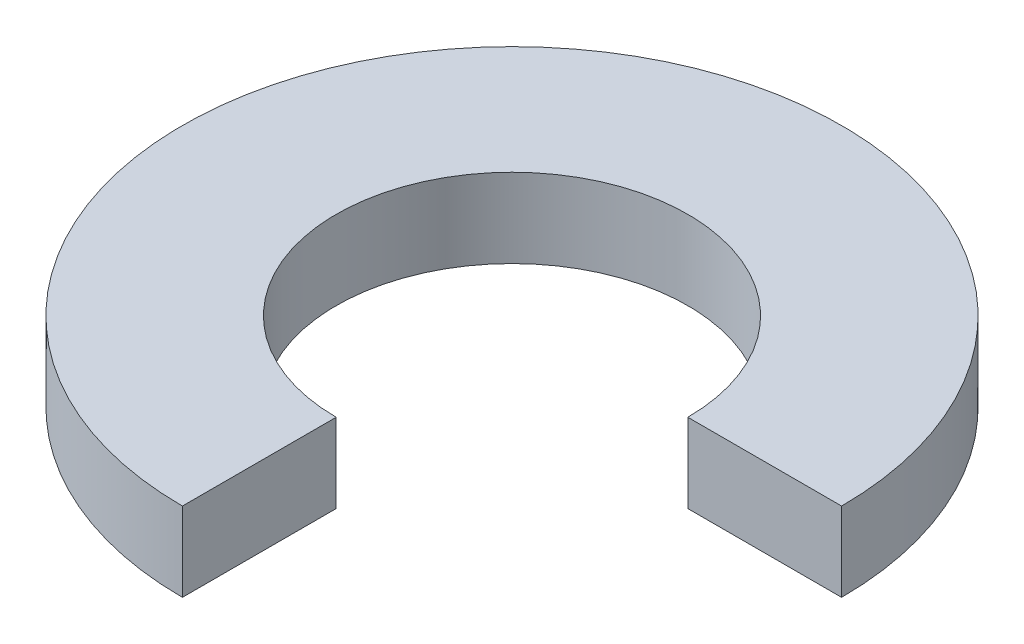
ISO-10303-21;
HEADER;
FILE_DESCRIPTION(('STEP AP214'),'2;1');
FILE_NAME('part.step','',(''),(''),'','','');
FILE_SCHEMA(('AUTOMOTIVE_DESIGN { 1 0 10303 214 1 1 1 1 }'));
ENDSEC;
DATA;
#1=APPLICATION_CONTEXT('core data for automotive mechanical design processes');
#2=APPLICATION_PROTOCOL_DEFINITION('international standard','automotive_design',2000,#1);
#3=PRODUCT_CONTEXT('',#1,'mechanical');
#4=PRODUCT('Part','Part','',(#3));
#5=PRODUCT_RELATED_PRODUCT_CATEGORY('part','',(#4));
#6=PRODUCT_DEFINITION_FORMATION('','',#4);
#7=PRODUCT_DEFINITION_CONTEXT('part definition',#1,'design');
#8=PRODUCT_DEFINITION('design','',#6,#7);
#9=PRODUCT_DEFINITION_SHAPE('','',#8);
#10=(LENGTH_UNIT() NAMED_UNIT(*) SI_UNIT(.MILLI.,.METRE.));
#11=(NAMED_UNIT(*) PLANE_ANGLE_UNIT() SI_UNIT($,.RADIAN.));
#12=(NAMED_UNIT(*) SI_UNIT($,.STERADIAN.) SOLID_ANGLE_UNIT());
#13=UNCERTAINTY_MEASURE_WITH_UNIT(LENGTH_MEASURE(1.E-05),#10,'distance_accuracy_value','');
#14=(GEOMETRIC_REPRESENTATION_CONTEXT(3) GLOBAL_UNCERTAINTY_ASSIGNED_CONTEXT((#13)) GLOBAL_UNIT_ASSIGNED_CONTEXT((#10,
#11,#12)) REPRESENTATION_CONTEXT('',''));
#15=CARTESIAN_POINT('',(0.,0.,0.));
#16=DIRECTION('',(0.,0.,1.));
#17=DIRECTION('',(1.,0.,0.));
#18=AXIS2_PLACEMENT_3D('',#15,#16,#17);
#19=CARTESIAN_POINT('',(0.,0.9,0.));
#20=DIRECTION('',(0.,-1.,0.));
#21=DIRECTION('',(0.,0.,-1.));
#22=AXIS2_PLACEMENT_3D('',#19,#20,#21);
#23=CYLINDRICAL_SURFACE('',#22,2.);
#24=CARTESIAN_POINT('',(0.,0.,0.));
#25=DIRECTION('',(0.,-1.,0.));
#26=DIRECTION('',(0.,0.,1.));
#27=AXIS2_PLACEMENT_3D('',#24,#25,#26);
#28=CIRCLE('',#27,2.);
#29=CARTESIAN_POINT('',(0.,0.,2.));
#30=VERTEX_POINT('',#29);
#31=CARTESIAN_POINT('',(2.,0.,0.));
#32=VERTEX_POINT('',#31);
#33=EDGE_CURVE('E104',#30,#32,#28,.T.);
#34=ORIENTED_EDGE('',*,*,#33,.T.);
#35=DIRECTION('',(0.,-1.,0.));
#36=VECTOR('',#35,1.);
#37=CARTESIAN_POINT('',(2.,0.9,0.));
#38=LINE('',#37,#36);
#39=CARTESIAN_POINT('',(2.,0.9,0.));
#40=VERTEX_POINT('',#39);
#41=EDGE_CURVE('E11',#40,#32,#38,.T.);
#42=ORIENTED_EDGE('',*,*,#41,.F.);
#43=CARTESIAN_POINT('',(0.,0.9,0.));
#44=DIRECTION('',(0.,-1.,0.));
#45=DIRECTION('',(0.,0.,1.));
#46=AXIS2_PLACEMENT_3D('',#43,#44,#45);
#47=CIRCLE('',#46,2.);
#48=CARTESIAN_POINT('',(0.,0.9,2.));
#49=VERTEX_POINT('',#48);
#50=EDGE_CURVE('E92',#49,#40,#47,.T.);
#51=ORIENTED_EDGE('',*,*,#50,.F.);
#52=DIRECTION('',(0.,-1.,0.));
#53=VECTOR('',#52,1.);
#54=CARTESIAN_POINT('',(0.,0.9,2.));
#55=LINE('',#54,#53);
#56=EDGE_CURVE('E100',#49,#30,#55,.T.);
#57=ORIENTED_EDGE('',*,*,#56,.T.);
#58=EDGE_LOOP('',(#34,#42,#51,#57));
#59=FACE_BOUND('',#58,.T.);
#60=ADVANCED_FACE('F41',(#59),#23,.F.);
#61=CARTESIAN_POINT('',(2.,0.9,0.));
#62=DIRECTION('',(0.,0.,-1.));
#63=DIRECTION('',(-1.,0.,0.));
#64=AXIS2_PLACEMENT_3D('',#61,#62,#63);
#65=PLANE('',#64);
#66=DIRECTION('',(1.,0.,0.));
#67=VECTOR('',#66,1.);
#68=CARTESIAN_POINT('',(2.,0.,0.));
#69=LINE('',#68,#67);
#70=CARTESIAN_POINT('',(3.75,0.,0.));
#71=VERTEX_POINT('',#70);
#72=EDGE_CURVE('E96',#32,#71,#69,.T.);
#73=ORIENTED_EDGE('',*,*,#72,.T.);
#74=DIRECTION('',(0.,-1.,0.));
#75=VECTOR('',#74,1.);
#76=CARTESIAN_POINT('',(3.75,0.9,0.));
#77=LINE('',#76,#75);
#78=CARTESIAN_POINT('',(3.75,0.9,0.));
#79=VERTEX_POINT('',#78);
#80=EDGE_CURVE('E49',#79,#71,#77,.T.);
#81=ORIENTED_EDGE('',*,*,#80,.F.);
#82=DIRECTION('',(1.,0.,0.));
#83=VECTOR('',#82,1.);
#84=CARTESIAN_POINT('',(2.,0.9,0.));
#85=LINE('',#84,#83);
#86=EDGE_CURVE('E87',#40,#79,#85,.T.);
#87=ORIENTED_EDGE('',*,*,#86,.F.);
#88=ORIENTED_EDGE('',*,*,#41,.T.);
#89=EDGE_LOOP('',(#73,#81,#87,#88));
#90=FACE_BOUND('',#89,.T.);
#91=ADVANCED_FACE('F95',(#90),#65,.F.);
#92=CARTESIAN_POINT('',(0.,0.9,0.));
#93=DIRECTION('',(0.,-1.,0.));
#94=DIRECTION('',(0.,0.,-1.));
#95=AXIS2_PLACEMENT_3D('',#92,#93,#94);
#96=CYLINDRICAL_SURFACE('',#95,3.75);
#97=CARTESIAN_POINT('',(0.,0.,0.));
#98=DIRECTION('',(0.,1.,0.));
#99=DIRECTION('',(0.,0.,1.));
#100=AXIS2_PLACEMENT_3D('',#97,#98,#99);
#101=CIRCLE('',#100,3.75);
#102=CARTESIAN_POINT('',(0.,0.,3.75));
#103=VERTEX_POINT('',#102);
#104=EDGE_CURVE('E74',#71,#103,#101,.T.);
#105=ORIENTED_EDGE('',*,*,#104,.T.);
#106=DIRECTION('',(0.,-1.,0.));
#107=VECTOR('',#106,1.);
#108=CARTESIAN_POINT('',(0.,0.9,3.75));
#109=LINE('',#108,#107);
#110=CARTESIAN_POINT('',(0.,0.9,3.75));
#111=VERTEX_POINT('',#110);
#112=EDGE_CURVE('E97',#111,#103,#109,.T.);
#113=ORIENTED_EDGE('',*,*,#112,.F.);
#114=CARTESIAN_POINT('',(0.,0.9,0.));
#115=DIRECTION('',(0.,1.,0.));
#116=DIRECTION('',(0.,0.,1.));
#117=AXIS2_PLACEMENT_3D('',#114,#115,#116);
#118=CIRCLE('',#117,3.75);
#119=EDGE_CURVE('E90',#79,#111,#118,.T.);
#120=ORIENTED_EDGE('',*,*,#119,.F.);
#121=ORIENTED_EDGE('',*,*,#80,.T.);
#122=EDGE_LOOP('',(#105,#113,#120,#121));
#123=FACE_BOUND('',#122,.T.);
#124=ADVANCED_FACE('F98',(#123),#96,.T.);
#125=CARTESIAN_POINT('',(0.,0.9,2.));
#126=DIRECTION('',(-1.,0.,0.));
#127=DIRECTION('',(0.,0.,1.));
#128=AXIS2_PLACEMENT_3D('',#125,#126,#127);
#129=PLANE('',#128);
#130=DIRECTION('',(0.,0.,-1.));
#131=VECTOR('',#130,1.);
#132=CARTESIAN_POINT('',(0.,0.,2.));
#133=LINE('',#132,#131);
#134=EDGE_CURVE('E80',#103,#30,#133,.T.);
#135=ORIENTED_EDGE('',*,*,#134,.T.);
#136=ORIENTED_EDGE('',*,*,#56,.F.);
#137=DIRECTION('',(0.,0.,-1.));
#138=VECTOR('',#137,1.);
#139=CARTESIAN_POINT('',(0.,0.9,2.));
#140=LINE('',#139,#138);
#141=EDGE_CURVE('E57',#111,#49,#140,.T.);
#142=ORIENTED_EDGE('',*,*,#141,.F.);
#143=ORIENTED_EDGE('',*,*,#112,.T.);
#144=EDGE_LOOP('',(#135,#136,#142,#143));
#145=FACE_BOUND('',#144,.T.);
#146=ADVANCED_FACE('F111',(#145),#129,.F.);
#147=CARTESIAN_POINT('',(0.,0.9,0.));
#148=DIRECTION('',(0.,1.,0.));
#149=DIRECTION('',(0.,0.,1.));
#150=AXIS2_PLACEMENT_3D('',#147,#148,#149);
#151=PLANE('',#150);
#152=ORIENTED_EDGE('',*,*,#50,.T.);
#153=ORIENTED_EDGE('',*,*,#86,.T.);
#154=ORIENTED_EDGE('',*,*,#119,.T.);
#155=ORIENTED_EDGE('',*,*,#141,.T.);
#156=EDGE_LOOP('',(#152,#153,#154,#155));
#157=FACE_BOUND('',#156,.T.);
#158=ADVANCED_FACE('F88',(#157),#151,.T.);
#159=CARTESIAN_POINT('',(0.,0.,0.));
#160=DIRECTION('',(0.,1.,0.));
#161=DIRECTION('',(0.,0.,1.));
#162=AXIS2_PLACEMENT_3D('',#159,#160,#161);
#163=PLANE('',#162);
#164=ORIENTED_EDGE('',*,*,#33,.F.);
#165=ORIENTED_EDGE('',*,*,#134,.F.);
#166=ORIENTED_EDGE('',*,*,#104,.F.);
#167=ORIENTED_EDGE('',*,*,#72,.F.);
#168=EDGE_LOOP('',(#164,#165,#166,#167));
#169=FACE_BOUND('',#168,.T.);
#170=ADVANCED_FACE('F114',(#169),#163,.F.);
#171=CLOSED_SHELL('',(#60,#91,#124,#146,#158,#170));
#172=MANIFOLD_SOLID_BREP('B2',#171);
#173=ADVANCED_BREP_SHAPE_REPRESENTATION('',(#18,#172),#14);
#174=SHAPE_DEFINITION_REPRESENTATION(#9,#173);
ENDSEC;
END-ISO-10303-21;
